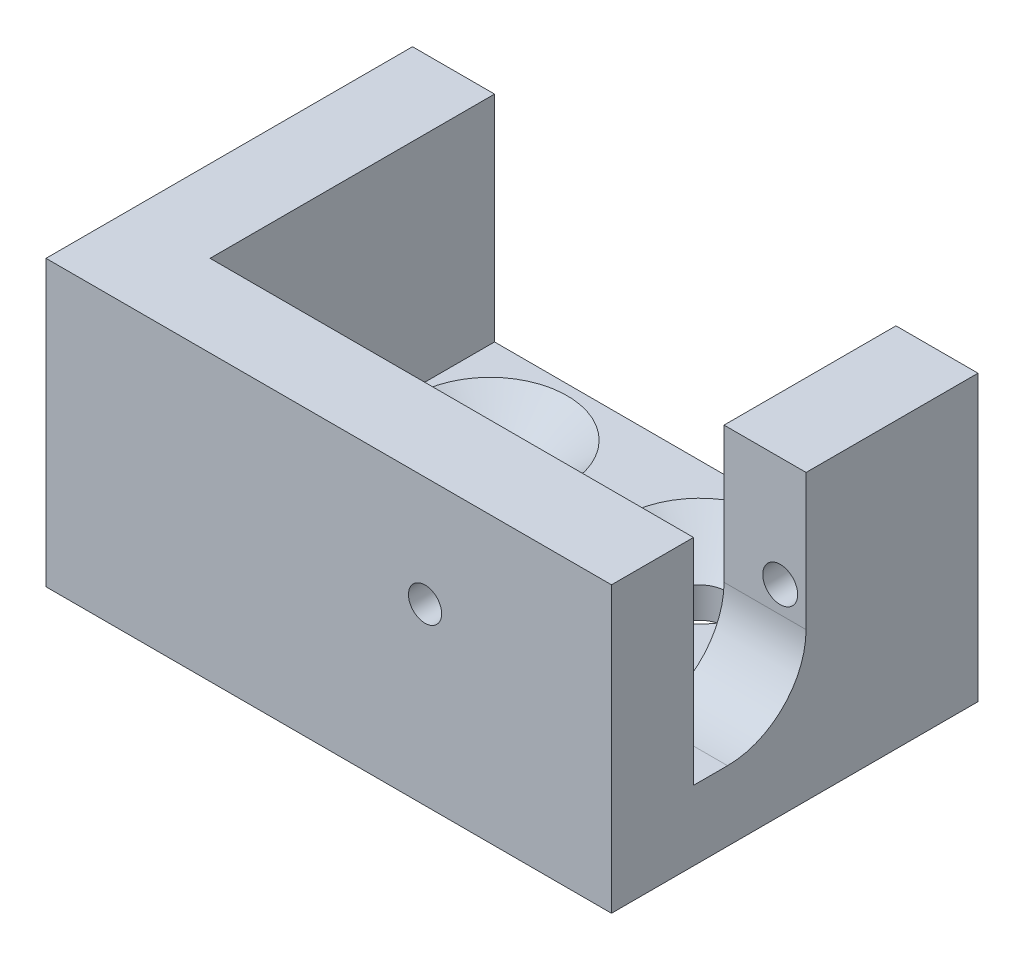
ISO-10303-21;
HEADER;
FILE_DESCRIPTION(('STEP AP214'),'2;1');
FILE_NAME('part.step','',(''),(''),'','','');
FILE_SCHEMA(('AUTOMOTIVE_DESIGN { 1 0 10303 214 1 1 1 1 }'));
ENDSEC;
DATA;
#1=APPLICATION_CONTEXT('core data for automotive mechanical design processes');
#2=APPLICATION_PROTOCOL_DEFINITION('international standard','automotive_design',2000,#1);
#3=PRODUCT_CONTEXT('',#1,'mechanical');
#4=PRODUCT('Part','Part','',(#3));
#5=PRODUCT_RELATED_PRODUCT_CATEGORY('part','',(#4));
#6=PRODUCT_DEFINITION_FORMATION('','',#4);
#7=PRODUCT_DEFINITION_CONTEXT('part definition',#1,'design');
#8=PRODUCT_DEFINITION('design','',#6,#7);
#9=PRODUCT_DEFINITION_SHAPE('','',#8);
#10=(LENGTH_UNIT() NAMED_UNIT(*) SI_UNIT(.MILLI.,.METRE.));
#11=(NAMED_UNIT(*) PLANE_ANGLE_UNIT() SI_UNIT($,.RADIAN.));
#12=(NAMED_UNIT(*) SI_UNIT($,.STERADIAN.) SOLID_ANGLE_UNIT());
#13=UNCERTAINTY_MEASURE_WITH_UNIT(LENGTH_MEASURE(1.E-05),#10,'distance_accuracy_value','');
#14=(GEOMETRIC_REPRESENTATION_CONTEXT(3) GLOBAL_UNCERTAINTY_ASSIGNED_CONTEXT((#13)) GLOBAL_UNIT_ASSIGNED_CONTEXT((#10,
#11,#12)) REPRESENTATION_CONTEXT('',''));
#15=CARTESIAN_POINT('',(0.,0.,0.));
#16=DIRECTION('',(0.,0.,1.));
#17=DIRECTION('',(1.,0.,0.));
#18=AXIS2_PLACEMENT_3D('',#15,#16,#17);
#19=CARTESIAN_POINT('',(0.,4.,0.));
#20=DIRECTION('',(0.,1.,0.));
#21=DIRECTION('',(0.,0.,1.));
#22=AXIS2_PLACEMENT_3D('',#19,#20,#21);
#23=PLANE('',#22);
#24=CARTESIAN_POINT('',(-6.,4.,5.00000000000001));
#25=DIRECTION('',(0.,1.,0.));
#26=DIRECTION('',(0.,0.,1.));
#27=AXIS2_PLACEMENT_3D('',#24,#25,#26);
#28=CIRCLE('',#27,4.41500000000001);
#29=CARTESIAN_POINT('',(-6.,4.,9.41500000000002));
#30=VERTEX_POINT('',#29);
#31=EDGE_CURVE('E51',#30,#30,#28,.F.);
#32=ORIENTED_EDGE('',*,*,#31,.T.);
#33=EDGE_LOOP('',(#32));
#34=FACE_BOUND('',#33,.T.);
#35=CARTESIAN_POINT('',(6.,4.,5.00000000000001));
#36=DIRECTION('',(0.,1.,0.));
#37=DIRECTION('',(0.,0.,1.));
#38=AXIS2_PLACEMENT_3D('',#35,#36,#37);
#39=CIRCLE('',#38,4.41500000000001);
#40=CARTESIAN_POINT('',(6.,4.,9.41500000000002));
#41=VERTEX_POINT('',#40);
#42=EDGE_CURVE('E272',#41,#41,#39,.F.);
#43=ORIENTED_EDGE('',*,*,#42,.T.);
#44=EDGE_LOOP('',(#43));
#45=FACE_BOUND('',#44,.T.);
#46=DIRECTION('',(0.,0.,-1.));
#47=VECTOR('',#46,1.);
#48=CARTESIAN_POINT('',(16.95,4.,0.));
#49=LINE('',#48,#47);
#50=CARTESIAN_POINT('',(16.95,4.,16.3));
#51=VERTEX_POINT('',#50);
#52=CARTESIAN_POINT('',(16.95,4.,14.35));
#53=VERTEX_POINT('',#52);
#54=EDGE_CURVE('E217',#51,#53,#49,.T.);
#55=ORIENTED_EDGE('',*,*,#54,.T.);
#56=DIRECTION('',(1.,0.,0.));
#57=VECTOR('',#56,1.);
#58=CARTESIAN_POINT('',(0.,4.,14.35));
#59=LINE('',#58,#57);
#60=CARTESIAN_POINT('',(12.25,4.,14.35));
#61=VERTEX_POINT('',#60);
#62=EDGE_CURVE('E260',#53,#61,#59,.F.);
#63=ORIENTED_EDGE('',*,*,#62,.T.);
#64=DIRECTION('',(0.,0.,1.));
#65=VECTOR('',#64,1.);
#66=CARTESIAN_POINT('',(12.25,4.,0.));
#67=LINE('',#66,#65);
#68=CARTESIAN_POINT('',(12.25,4.,0.));
#69=VERTEX_POINT('',#68);
#70=EDGE_CURVE('E58',#69,#61,#67,.T.);
#71=ORIENTED_EDGE('',*,*,#70,.F.);
#72=DIRECTION('',(-1.,0.,0.));
#73=VECTOR('',#72,1.);
#74=CARTESIAN_POINT('',(-15.45,4.,0.));
#75=LINE('',#74,#73);
#76=CARTESIAN_POINT('',(-10.75,4.,0.));
#77=VERTEX_POINT('',#76);
#78=EDGE_CURVE('E220',#69,#77,#75,.T.);
#79=ORIENTED_EDGE('',*,*,#78,.T.);
#80=DIRECTION('',(0.,0.,-1.));
#81=VECTOR('',#80,1.);
#82=CARTESIAN_POINT('',(-10.75,4.,0.));
#83=LINE('',#82,#81);
#84=CARTESIAN_POINT('',(-10.75,4.,16.3));
#85=VERTEX_POINT('',#84);
#86=EDGE_CURVE('E181',#85,#77,#83,.T.);
#87=ORIENTED_EDGE('',*,*,#86,.F.);
#88=DIRECTION('',(-1.,0.,0.));
#89=VECTOR('',#88,1.);
#90=CARTESIAN_POINT('',(16.95,4.,16.3));
#91=LINE('',#90,#89);
#92=EDGE_CURVE('E175',#51,#85,#91,.T.);
#93=ORIENTED_EDGE('',*,*,#92,.F.);
#94=EDGE_LOOP('',(#55,#63,#71,#79,#87,#93));
#95=FACE_BOUND('',#94,.T.);
#96=ADVANCED_FACE('F41',(#34,#45,#95),#23,.T.);
#97=CARTESIAN_POINT('',(-15.45,4.,0.));
#98=DIRECTION('',(1.,0.,0.));
#99=DIRECTION('',(0.,0.,-1.));
#100=AXIS2_PLACEMENT_3D('',#97,#98,#99);
#101=PLANE('',#100);
#102=DIRECTION('',(0.,0.,1.));
#103=VECTOR('',#102,1.);
#104=CARTESIAN_POINT('',(-15.45,0.,0.));
#105=LINE('',#104,#103);
#106=CARTESIAN_POINT('',(-15.45,0.,0.));
#107=VERTEX_POINT('',#106);
#108=CARTESIAN_POINT('',(-15.45,0.,21.));
#109=VERTEX_POINT('',#108);
#110=EDGE_CURVE('E216',#107,#109,#105,.T.);
#111=ORIENTED_EDGE('',*,*,#110,.T.);
#112=DIRECTION('',(0.,-1.,0.));
#113=VECTOR('',#112,1.);
#114=CARTESIAN_POINT('',(-15.45,4.,21.));
#115=LINE('',#114,#113);
#116=CARTESIAN_POINT('',(-15.45,16.3,21.));
#117=VERTEX_POINT('',#116);
#118=EDGE_CURVE('E239',#117,#109,#115,.T.);
#119=ORIENTED_EDGE('',*,*,#118,.F.);
#120=DIRECTION('',(0.,0.,1.));
#121=VECTOR('',#120,1.);
#122=CARTESIAN_POINT('',(-15.45,16.3,0.));
#123=LINE('',#122,#121);
#124=CARTESIAN_POINT('',(-15.45,16.3,0.));
#125=VERTEX_POINT('',#124);
#126=EDGE_CURVE('E176',#125,#117,#123,.T.);
#127=ORIENTED_EDGE('',*,*,#126,.F.);
#128=DIRECTION('',(0.,-1.,0.));
#129=VECTOR('',#128,1.);
#130=CARTESIAN_POINT('',(-15.45,4.,0.));
#131=LINE('',#130,#129);
#132=EDGE_CURVE('E138',#125,#107,#131,.T.);
#133=ORIENTED_EDGE('',*,*,#132,.T.);
#134=EDGE_LOOP('',(#111,#119,#127,#133));
#135=FACE_BOUND('',#134,.T.);
#136=ADVANCED_FACE('F336',(#135),#101,.F.);
#137=CARTESIAN_POINT('',(-15.45,4.,21.));
#138=DIRECTION('',(0.,0.,-1.));
#139=DIRECTION('',(-1.,0.,0.));
#140=AXIS2_PLACEMENT_3D('',#137,#138,#139);
#141=PLANE('',#140);
#142=CARTESIAN_POINT('',(6.26837206051751,10.,21.));
#143=DIRECTION('',(0.,0.,1.));
#144=DIRECTION('',(1.,0.,0.));
#145=AXIS2_PLACEMENT_3D('',#142,#143,#144);
#146=CIRCLE('',#145,0.949999999999997);
#147=CARTESIAN_POINT('',(7.21837206051751,10.,21.));
#148=VERTEX_POINT('',#147);
#149=EDGE_CURVE('E157',#148,#148,#146,.T.);
#150=ORIENTED_EDGE('',*,*,#149,.F.);
#151=EDGE_LOOP('',(#150));
#152=FACE_BOUND('',#151,.T.);
#153=DIRECTION('',(1.,0.,0.));
#154=VECTOR('',#153,1.);
#155=CARTESIAN_POINT('',(-15.45,0.,21.));
#156=LINE('',#155,#154);
#157=CARTESIAN_POINT('',(16.95,0.,21.));
#158=VERTEX_POINT('',#157);
#159=EDGE_CURVE('E227',#109,#158,#156,.T.);
#160=ORIENTED_EDGE('',*,*,#159,.T.);
#161=DIRECTION('',(0.,-1.,0.));
#162=VECTOR('',#161,1.);
#163=CARTESIAN_POINT('',(16.95,4.,21.));
#164=LINE('',#163,#162);
#165=CARTESIAN_POINT('',(16.95,16.3,21.));
#166=VERTEX_POINT('',#165);
#167=EDGE_CURVE('E137',#166,#158,#164,.T.);
#168=ORIENTED_EDGE('',*,*,#167,.F.);
#169=DIRECTION('',(1.,0.,0.));
#170=VECTOR('',#169,1.);
#171=CARTESIAN_POINT('',(16.95,16.3,21.));
#172=LINE('',#171,#170);
#173=EDGE_CURVE('E180',#117,#166,#172,.T.);
#174=ORIENTED_EDGE('',*,*,#173,.F.);
#175=ORIENTED_EDGE('',*,*,#118,.T.);
#176=EDGE_LOOP('',(#160,#168,#174,#175));
#177=FACE_BOUND('',#176,.T.);
#178=ADVANCED_FACE('F332',(#152,#177),#141,.F.);
#179=CARTESIAN_POINT('',(16.95,4.,0.));
#180=DIRECTION('',(-1.,0.,0.));
#181=DIRECTION('',(0.,0.,1.));
#182=AXIS2_PLACEMENT_3D('',#179,#180,#181);
#183=PLANE('',#182);
#184=DIRECTION('',(0.,0.,-1.));
#185=VECTOR('',#184,1.);
#186=CARTESIAN_POINT('',(16.95,0.,0.));
#187=LINE('',#186,#185);
#188=CARTESIAN_POINT('',(16.95,0.,0.));
#189=VERTEX_POINT('',#188);
#190=EDGE_CURVE('E133',#158,#189,#187,.T.);
#191=ORIENTED_EDGE('',*,*,#190,.T.);
#192=DIRECTION('',(0.,-1.,0.));
#193=VECTOR('',#192,1.);
#194=CARTESIAN_POINT('',(16.95,4.,0.));
#195=LINE('',#194,#193);
#196=CARTESIAN_POINT('',(16.95,16.3,0.));
#197=VERTEX_POINT('',#196);
#198=EDGE_CURVE('E126',#197,#189,#195,.T.);
#199=ORIENTED_EDGE('',*,*,#198,.F.);
#200=DIRECTION('',(0.,0.,-1.));
#201=VECTOR('',#200,1.);
#202=CARTESIAN_POINT('',(16.95,16.3,0.));
#203=LINE('',#202,#201);
#204=CARTESIAN_POINT('',(16.95,16.3,9.85000000000001));
#205=VERTEX_POINT('',#204);
#206=EDGE_CURVE('E130',#205,#197,#203,.T.);
#207=ORIENTED_EDGE('',*,*,#206,.F.);
#208=DIRECTION('',(0.,-1.,0.));
#209=VECTOR('',#208,1.);
#210=CARTESIAN_POINT('',(16.95,16.3,9.85000000000001));
#211=LINE('',#210,#209);
#212=CARTESIAN_POINT('',(16.95,8.5,9.85000000000001));
#213=VERTEX_POINT('',#212);
#214=EDGE_CURVE('E165',#205,#213,#211,.T.);
#215=ORIENTED_EDGE('',*,*,#214,.T.);
#216=CARTESIAN_POINT('',(16.95,8.5,14.35));
#217=DIRECTION('',(-1.,0.,0.));
#218=DIRECTION('',(0.,0.,1.));
#219=AXIS2_PLACEMENT_3D('',#216,#217,#218);
#220=CIRCLE('',#219,4.5);
#221=EDGE_CURVE('E66',#213,#53,#220,.T.);
#222=ORIENTED_EDGE('',*,*,#221,.T.);
#223=ORIENTED_EDGE('',*,*,#54,.F.);
#224=DIRECTION('',(0.,-1.,0.));
#225=VECTOR('',#224,1.);
#226=CARTESIAN_POINT('',(16.95,16.3,16.3));
#227=LINE('',#226,#225);
#228=CARTESIAN_POINT('',(16.95,16.3,16.3));
#229=VERTEX_POINT('',#228);
#230=EDGE_CURVE('E212',#229,#51,#227,.T.);
#231=ORIENTED_EDGE('',*,*,#230,.F.);
#232=DIRECTION('',(0.,0.,-1.));
#233=VECTOR('',#232,1.);
#234=CARTESIAN_POINT('',(16.95,16.3,16.3));
#235=LINE('',#234,#233);
#236=EDGE_CURVE('E185',#166,#229,#235,.T.);
#237=ORIENTED_EDGE('',*,*,#236,.F.);
#238=ORIENTED_EDGE('',*,*,#167,.T.);
#239=EDGE_LOOP('',(#191,#199,#207,#215,#222,#223,#231,#237,#238));
#240=FACE_BOUND('',#239,.T.);
#241=ADVANCED_FACE('F128',(#240),#183,.F.);
#242=CARTESIAN_POINT('',(-15.45,4.,0.));
#243=DIRECTION('',(0.,0.,1.));
#244=DIRECTION('',(1.,0.,0.));
#245=AXIS2_PLACEMENT_3D('',#242,#243,#244);
#246=PLANE('',#245);
#247=CARTESIAN_POINT('',(15.4682683390567,10.,0.));
#248=DIRECTION('',(0.,0.,-1.));
#249=DIRECTION('',(-1.,0.,0.));
#250=AXIS2_PLACEMENT_3D('',#247,#248,#249);
#251=CIRCLE('',#250,1.);
#252=CARTESIAN_POINT('',(14.4682683390567,10.,0.));
#253=VERTEX_POINT('',#252);
#254=EDGE_CURVE('E256',#253,#253,#251,.T.);
#255=ORIENTED_EDGE('',*,*,#254,.F.);
#256=EDGE_LOOP('',(#255));
#257=FACE_BOUND('',#256,.T.);
#258=CARTESIAN_POINT('',(-13.2783546303813,10.,0.));
#259=DIRECTION('',(0.,0.,-1.));
#260=DIRECTION('',(-1.,0.,0.));
#261=AXIS2_PLACEMENT_3D('',#258,#259,#260);
#262=CIRCLE('',#261,1.);
#263=CARTESIAN_POINT('',(-14.2783546303813,10.,0.));
#264=VERTEX_POINT('',#263);
#265=EDGE_CURVE('E296',#264,#264,#262,.T.);
#266=ORIENTED_EDGE('',*,*,#265,.F.);
#267=EDGE_LOOP('',(#266));
#268=FACE_BOUND('',#267,.T.);
#269=DIRECTION('',(-1.,0.,0.));
#270=VECTOR('',#269,1.);
#271=CARTESIAN_POINT('',(-15.45,0.,0.));
#272=LINE('',#271,#270);
#273=EDGE_CURVE('E221',#189,#107,#272,.T.);
#274=ORIENTED_EDGE('',*,*,#273,.T.);
#275=ORIENTED_EDGE('',*,*,#132,.F.);
#276=DIRECTION('',(-1.,0.,0.));
#277=VECTOR('',#276,1.);
#278=CARTESIAN_POINT('',(-15.45,16.3,0.));
#279=LINE('',#278,#277);
#280=CARTESIAN_POINT('',(-10.75,16.3,0.));
#281=VERTEX_POINT('',#280);
#282=EDGE_CURVE('E194',#281,#125,#279,.T.);
#283=ORIENTED_EDGE('',*,*,#282,.F.);
#284=DIRECTION('',(0.,-1.,0.));
#285=VECTOR('',#284,1.);
#286=CARTESIAN_POINT('',(-10.75,16.3,0.));
#287=LINE('',#286,#285);
#288=EDGE_CURVE('E198',#281,#77,#287,.T.);
#289=ORIENTED_EDGE('',*,*,#288,.T.);
#290=ORIENTED_EDGE('',*,*,#78,.F.);
#291=DIRECTION('',(0.,-1.,0.));
#292=VECTOR('',#291,1.);
#293=CARTESIAN_POINT('',(12.25,16.3,0.));
#294=LINE('',#293,#292);
#295=CARTESIAN_POINT('',(12.25,16.3,0.));
#296=VERTEX_POINT('',#295);
#297=EDGE_CURVE('E144',#296,#69,#294,.T.);
#298=ORIENTED_EDGE('',*,*,#297,.F.);
#299=DIRECTION('',(-1.,0.,0.));
#300=VECTOR('',#299,1.);
#301=CARTESIAN_POINT('',(16.95,16.3,0.));
#302=LINE('',#301,#300);
#303=EDGE_CURVE('E141',#197,#296,#302,.T.);
#304=ORIENTED_EDGE('',*,*,#303,.F.);
#305=ORIENTED_EDGE('',*,*,#198,.T.);
#306=EDGE_LOOP('',(#274,#275,#283,#289,#290,#298,#304,#305));
#307=FACE_BOUND('',#306,.T.);
#308=ADVANCED_FACE('F142',(#257,#268,#307),#246,.F.);
#309=CARTESIAN_POINT('',(0.,0.,0.));
#310=DIRECTION('',(0.,1.,0.));
#311=DIRECTION('',(0.,0.,1.));
#312=AXIS2_PLACEMENT_3D('',#309,#310,#311);
#313=PLANE('',#312);
#314=CARTESIAN_POINT('',(-6.,0.,5.00000000000001));
#315=DIRECTION('',(0.,1.,0.));
#316=DIRECTION('',(0.,0.,1.));
#317=AXIS2_PLACEMENT_3D('',#314,#315,#316);
#318=CIRCLE('',#317,1.5);
#319=CARTESIAN_POINT('',(-6.,0.,6.50000000000001));
#320=VERTEX_POINT('',#319);
#321=EDGE_CURVE('E293',#320,#320,#318,.T.);
#322=ORIENTED_EDGE('',*,*,#321,.T.);
#323=EDGE_LOOP('',(#322));
#324=FACE_BOUND('',#323,.T.);
#325=CARTESIAN_POINT('',(6.,0.,5.00000000000001));
#326=DIRECTION('',(0.,1.,0.));
#327=DIRECTION('',(0.,0.,1.));
#328=AXIS2_PLACEMENT_3D('',#325,#326,#327);
#329=CIRCLE('',#328,1.5);
#330=CARTESIAN_POINT('',(6.,0.,6.50000000000001));
#331=VERTEX_POINT('',#330);
#332=EDGE_CURVE('E297',#331,#331,#329,.T.);
#333=ORIENTED_EDGE('',*,*,#332,.T.);
#334=EDGE_LOOP('',(#333));
#335=FACE_BOUND('',#334,.T.);
#336=ORIENTED_EDGE('',*,*,#110,.F.);
#337=ORIENTED_EDGE('',*,*,#273,.F.);
#338=ORIENTED_EDGE('',*,*,#190,.F.);
#339=ORIENTED_EDGE('',*,*,#159,.F.);
#340=EDGE_LOOP('',(#336,#337,#338,#339));
#341=FACE_BOUND('',#340,.T.);
#342=ADVANCED_FACE('F323',(#324,#335,#341),#313,.F.);
#343=CARTESIAN_POINT('',(16.95,16.3,16.3));
#344=DIRECTION('',(0.,0.,1.));
#345=DIRECTION('',(1.,0.,0.));
#346=AXIS2_PLACEMENT_3D('',#343,#344,#345);
#347=PLANE('',#346);
#348=CARTESIAN_POINT('',(6.26837206051751,10.,16.3));
#349=DIRECTION('',(0.,0.,1.));
#350=DIRECTION('',(1.,0.,0.));
#351=AXIS2_PLACEMENT_3D('',#348,#349,#350);
#352=CIRCLE('',#351,2.865);
#353=CARTESIAN_POINT('',(3.40337206051751,10.,16.3));
#354=VERTEX_POINT('',#353);
#355=EDGE_CURVE('E247',#354,#354,#352,.T.);
#356=ORIENTED_EDGE('',*,*,#355,.T.);
#357=EDGE_LOOP('',(#356));
#358=FACE_BOUND('',#357,.T.);
#359=ORIENTED_EDGE('',*,*,#92,.T.);
#360=DIRECTION('',(0.,-1.,0.));
#361=VECTOR('',#360,1.);
#362=CARTESIAN_POINT('',(-10.75,16.3,16.3));
#363=LINE('',#362,#361);
#364=CARTESIAN_POINT('',(-10.75,16.3,16.3));
#365=VERTEX_POINT('',#364);
#366=EDGE_CURVE('E208',#365,#85,#363,.T.);
#367=ORIENTED_EDGE('',*,*,#366,.F.);
#368=DIRECTION('',(-1.,0.,0.));
#369=VECTOR('',#368,1.);
#370=CARTESIAN_POINT('',(16.95,16.3,16.3));
#371=LINE('',#370,#369);
#372=EDGE_CURVE('E188',#229,#365,#371,.T.);
#373=ORIENTED_EDGE('',*,*,#372,.F.);
#374=ORIENTED_EDGE('',*,*,#230,.T.);
#375=EDGE_LOOP('',(#359,#367,#373,#374));
#376=FACE_BOUND('',#375,.T.);
#377=ADVANCED_FACE('F330',(#358,#376),#347,.F.);
#378=CARTESIAN_POINT('',(-10.75,16.3,0.));
#379=DIRECTION('',(-1.,0.,0.));
#380=DIRECTION('',(0.,0.,1.));
#381=AXIS2_PLACEMENT_3D('',#378,#379,#380);
#382=PLANE('',#381);
#383=ORIENTED_EDGE('',*,*,#86,.T.);
#384=ORIENTED_EDGE('',*,*,#288,.F.);
#385=DIRECTION('',(0.,0.,-1.));
#386=VECTOR('',#385,1.);
#387=CARTESIAN_POINT('',(-10.75,16.3,0.));
#388=LINE('',#387,#386);
#389=EDGE_CURVE('E191',#365,#281,#388,.T.);
#390=ORIENTED_EDGE('',*,*,#389,.F.);
#391=ORIENTED_EDGE('',*,*,#366,.T.);
#392=EDGE_LOOP('',(#383,#384,#390,#391));
#393=FACE_BOUND('',#392,.T.);
#394=ADVANCED_FACE('F346',(#393),#382,.F.);
#395=CARTESIAN_POINT('',(0.,16.3,0.));
#396=DIRECTION('',(0.,-1.,0.));
#397=DIRECTION('',(0.,0.,-1.));
#398=AXIS2_PLACEMENT_3D('',#395,#396,#397);
#399=PLANE('',#398);
#400=ORIENTED_EDGE('',*,*,#126,.T.);
#401=ORIENTED_EDGE('',*,*,#173,.T.);
#402=ORIENTED_EDGE('',*,*,#236,.T.);
#403=ORIENTED_EDGE('',*,*,#372,.T.);
#404=ORIENTED_EDGE('',*,*,#389,.T.);
#405=ORIENTED_EDGE('',*,*,#282,.T.);
#406=EDGE_LOOP('',(#400,#401,#402,#403,#404,#405));
#407=FACE_BOUND('',#406,.T.);
#408=ADVANCED_FACE('F350',(#407),#399,.F.);
#409=CARTESIAN_POINT('',(12.25,16.3,0.));
#410=DIRECTION('',(1.,0.,0.));
#411=DIRECTION('',(0.,0.,-1.));
#412=AXIS2_PLACEMENT_3D('',#409,#410,#411);
#413=PLANE('',#412);
#414=ORIENTED_EDGE('',*,*,#70,.T.);
#415=CARTESIAN_POINT('',(12.25,8.5,14.35));
#416=DIRECTION('',(1.,0.,0.));
#417=DIRECTION('',(0.,0.,-1.));
#418=AXIS2_PLACEMENT_3D('',#415,#416,#417);
#419=CIRCLE('',#418,4.5);
#420=CARTESIAN_POINT('',(12.25,8.5,9.85000000000001));
#421=VERTEX_POINT('',#420);
#422=EDGE_CURVE('E265',#61,#421,#419,.T.);
#423=ORIENTED_EDGE('',*,*,#422,.T.);
#424=DIRECTION('',(0.,-1.,0.));
#425=VECTOR('',#424,1.);
#426=CARTESIAN_POINT('',(12.25,16.3,9.85000000000001));
#427=LINE('',#426,#425);
#428=CARTESIAN_POINT('',(12.25,16.3,9.85000000000001));
#429=VERTEX_POINT('',#428);
#430=EDGE_CURVE('E169',#429,#421,#427,.T.);
#431=ORIENTED_EDGE('',*,*,#430,.F.);
#432=DIRECTION('',(0.,0.,1.));
#433=VECTOR('',#432,1.);
#434=CARTESIAN_POINT('',(12.25,16.3,0.));
#435=LINE('',#434,#433);
#436=EDGE_CURVE('E148',#296,#429,#435,.T.);
#437=ORIENTED_EDGE('',*,*,#436,.F.);
#438=ORIENTED_EDGE('',*,*,#297,.T.);
#439=EDGE_LOOP('',(#414,#423,#431,#437,#438));
#440=FACE_BOUND('',#439,.T.);
#441=ADVANCED_FACE('F354',(#440),#413,.F.);
#442=CARTESIAN_POINT('',(16.95,16.3,9.85000000000001));
#443=DIRECTION('',(0.,0.,-1.));
#444=DIRECTION('',(-1.,0.,0.));
#445=AXIS2_PLACEMENT_3D('',#442,#443,#444);
#446=PLANE('',#445);
#447=CARTESIAN_POINT('',(15.4682683390567,10.,9.85000000000001));
#448=DIRECTION('',(0.,0.,-1.));
#449=DIRECTION('',(-1.,0.,0.));
#450=AXIS2_PLACEMENT_3D('',#447,#448,#449);
#451=CIRCLE('',#450,1.);
#452=CARTESIAN_POINT('',(14.4682683390567,10.,9.85000000000001));
#453=VERTEX_POINT('',#452);
#454=EDGE_CURVE('E252',#453,#453,#451,.T.);
#455=ORIENTED_EDGE('',*,*,#454,.T.);
#456=EDGE_LOOP('',(#455));
#457=FACE_BOUND('',#456,.T.);
#458=ORIENTED_EDGE('',*,*,#430,.T.);
#459=DIRECTION('',(1.,0.,0.));
#460=VECTOR('',#459,1.);
#461=CARTESIAN_POINT('',(16.95,8.5,9.85000000000001));
#462=LINE('',#461,#460);
#463=EDGE_CURVE('E251',#421,#213,#462,.T.);
#464=ORIENTED_EDGE('',*,*,#463,.T.);
#465=ORIENTED_EDGE('',*,*,#214,.F.);
#466=DIRECTION('',(1.,0.,0.));
#467=VECTOR('',#466,1.);
#468=CARTESIAN_POINT('',(16.95,16.3,9.85000000000001));
#469=LINE('',#468,#467);
#470=EDGE_CURVE('E152',#429,#205,#469,.T.);
#471=ORIENTED_EDGE('',*,*,#470,.F.);
#472=EDGE_LOOP('',(#458,#464,#465,#471));
#473=FACE_BOUND('',#472,.T.);
#474=ADVANCED_FACE('F358',(#457,#473),#446,.F.);
#475=CARTESIAN_POINT('',(0.,16.3,0.));
#476=DIRECTION('',(0.,-1.,0.));
#477=DIRECTION('',(0.,0.,-1.));
#478=AXIS2_PLACEMENT_3D('',#475,#476,#477);
#479=PLANE('',#478);
#480=ORIENTED_EDGE('',*,*,#206,.T.);
#481=ORIENTED_EDGE('',*,*,#303,.T.);
#482=ORIENTED_EDGE('',*,*,#436,.T.);
#483=ORIENTED_EDGE('',*,*,#470,.T.);
#484=EDGE_LOOP('',(#480,#481,#482,#483));
#485=FACE_BOUND('',#484,.T.);
#486=ADVANCED_FACE('F150',(#485),#479,.F.);
#487=CARTESIAN_POINT('',(6.26837206051751,10.,-0.000999999999990592));
#488=DIRECTION('',(0.,0.,1.));
#489=DIRECTION('',(1.,0.,0.));
#490=AXIS2_PLACEMENT_3D('',#487,#488,#489);
#491=CYLINDRICAL_SURFACE('',#490,0.949999999999997);
#492=CARTESIAN_POINT('',(6.26837206051751,10.,17.9));
#493=DIRECTION('',(0.,0.,1.));
#494=DIRECTION('',(1.,0.,0.));
#495=AXIS2_PLACEMENT_3D('',#492,#493,#494);
#496=CIRCLE('',#495,0.949999999999997);
#497=CARTESIAN_POINT('',(5.31837206051751,10.,17.9));
#498=VERTEX_POINT('',#497);
#499=EDGE_CURVE('E243',#498,#498,#496,.F.);
#500=ORIENTED_EDGE('',*,*,#499,.T.);
#501=EDGE_LOOP('',(#500));
#502=FACE_BOUND('',#501,.T.);
#503=ORIENTED_EDGE('',*,*,#149,.T.);
#504=EDGE_LOOP('',(#503));
#505=FACE_BOUND('',#504,.T.);
#506=ADVANCED_FACE('F364',(#502,#505),#491,.F.);
#507=CARTESIAN_POINT('',(6.26837206051751,10.,17.9));
#508=DIRECTION('',(0.,0.,-1.));
#509=DIRECTION('',(-1.,0.,0.));
#510=AXIS2_PLACEMENT_3D('',#507,#508,#509);
#511=CONICAL_SURFACE('',#510,0.949999999999997,0.87477534222011);
#512=CARTESIAN_POINT('',(3.40337206051751,10.,16.3));
#513=CARTESIAN_POINT('',(3.42331997718418,10.,16.3166666666667));
#514=CARTESIAN_POINT('',(3.44326789385084,10.,16.3333333333333));
#515=CARTESIAN_POINT('',(3.48316372718418,10.,16.3666666666667));
#516=CARTESIAN_POINT('',(3.50311164385084,10.,16.3833333333333));
#517=CARTESIAN_POINT('',(3.54300747718418,10.,16.4166666666667));
#518=CARTESIAN_POINT('',(3.56295539385084,10.,16.4333333333333));
#519=CARTESIAN_POINT('',(3.60285122718418,10.,16.4666666666667));
#520=CARTESIAN_POINT('',(3.62279914385084,10.,16.4833333333333));
#521=CARTESIAN_POINT('',(3.66269497718418,10.,16.5166666666667));
#522=CARTESIAN_POINT('',(3.68264289385084,10.,16.5333333333333));
#523=CARTESIAN_POINT('',(3.72253872718418,10.,16.5666666666667));
#524=CARTESIAN_POINT('',(3.74248664385084,10.,16.5833333333333));
#525=CARTESIAN_POINT('',(3.78238247718418,10.,16.6166666666667));
#526=CARTESIAN_POINT('',(3.80233039385084,10.,16.6333333333333));
#527=CARTESIAN_POINT('',(3.84222622718418,10.,16.6666666666667));
#528=CARTESIAN_POINT('',(3.86217414385084,10.,16.6833333333333));
#529=CARTESIAN_POINT('',(3.90206997718418,10.,16.7166666666667));
#530=CARTESIAN_POINT('',(3.92201789385084,10.,16.7333333333333));
#531=CARTESIAN_POINT('',(3.96191372718418,10.,16.7666666666667));
#532=CARTESIAN_POINT('',(3.98186164385084,10.,16.7833333333333));
#533=CARTESIAN_POINT('',(4.02175747718418,10.,16.8166666666667));
#534=CARTESIAN_POINT('',(4.04170539385084,10.,16.8333333333333));
#535=CARTESIAN_POINT('',(4.08160122718418,10.,16.8666666666667));
#536=CARTESIAN_POINT('',(4.10154914385084,10.,16.8833333333333));
#537=CARTESIAN_POINT('',(4.14144497718418,10.,16.9166666666667));
#538=CARTESIAN_POINT('',(4.16139289385084,10.,16.9333333333333));
#539=CARTESIAN_POINT('',(4.20128872718418,10.,16.9666666666667));
#540=CARTESIAN_POINT('',(4.22123664385084,10.,16.9833333333333));
#541=CARTESIAN_POINT('',(4.26113247718418,10.,17.0166666666667));
#542=CARTESIAN_POINT('',(4.28108039385084,10.,17.0333333333333));
#543=CARTESIAN_POINT('',(4.32097622718418,10.,17.0666666666667));
#544=CARTESIAN_POINT('',(4.34092414385084,10.,17.0833333333333));
#545=CARTESIAN_POINT('',(4.38081997718418,10.,17.1166666666667));
#546=CARTESIAN_POINT('',(4.40076789385084,10.,17.1333333333333));
#547=CARTESIAN_POINT('',(4.44066372718418,10.,17.1666666666667));
#548=CARTESIAN_POINT('',(4.46061164385084,10.,17.1833333333333));
#549=CARTESIAN_POINT('',(4.50050747718418,10.,17.2166666666667));
#550=CARTESIAN_POINT('',(4.52045539385084,10.,17.2333333333333));
#551=CARTESIAN_POINT('',(4.56035122718418,10.,17.2666666666667));
#552=CARTESIAN_POINT('',(4.58029914385084,10.,17.2833333333333));
#553=CARTESIAN_POINT('',(4.62019497718418,10.,17.3166666666667));
#554=CARTESIAN_POINT('',(4.64014289385084,10.,17.3333333333333));
#555=CARTESIAN_POINT('',(4.68003872718417,10.,17.3666666666667));
#556=CARTESIAN_POINT('',(4.69998664385084,10.,17.3833333333333));
#557=CARTESIAN_POINT('',(4.73988247718417,10.,17.4166666666667));
#558=CARTESIAN_POINT('',(4.75983039385084,10.,17.4333333333333));
#559=CARTESIAN_POINT('',(4.79972622718418,10.,17.4666666666667));
#560=CARTESIAN_POINT('',(4.81967414385084,10.,17.4833333333333));
#561=CARTESIAN_POINT('',(4.85956997718417,10.,17.5166666666667));
#562=CARTESIAN_POINT('',(4.87951789385084,10.,17.5333333333333));
#563=CARTESIAN_POINT('',(4.91941372718417,10.,17.5666666666667));
#564=CARTESIAN_POINT('',(4.93936164385084,10.,17.5833333333333));
#565=CARTESIAN_POINT('',(4.97925747718417,10.,17.6166666666667));
#566=CARTESIAN_POINT('',(4.99920539385084,10.,17.6333333333333));
#567=CARTESIAN_POINT('',(5.03910122718418,10.,17.6666666666667));
#568=CARTESIAN_POINT('',(5.05904914385084,10.,17.6833333333333));
#569=CARTESIAN_POINT('',(5.09894497718417,10.,17.7166666666667));
#570=CARTESIAN_POINT('',(5.11889289385084,10.,17.7333333333333));
#571=CARTESIAN_POINT('',(5.15878872718417,10.,17.7666666666667));
#572=CARTESIAN_POINT('',(5.17873664385084,10.,17.7833333333333));
#573=CARTESIAN_POINT('',(5.21863247718418,10.,17.8166666666667));
#574=CARTESIAN_POINT('',(5.23858039385084,10.,17.8333333333333));
#575=CARTESIAN_POINT('',(5.27847622718417,10.,17.8666666666667));
#576=CARTESIAN_POINT('',(5.29842414385084,10.,17.8833333333333));
#577=CARTESIAN_POINT('',(5.31837206051751,10.,17.9));
#578=B_SPLINE_CURVE_WITH_KNOTS('',3,(#512,#513,#514,#515,#516,#517,#518,#519,#520,#521,#522,
#523,#524,#525,#526,#527,#528,#529,#530,#531,#532,#533,#534,#535,#536,#537,#538,#539,#540,#541,
#542,#543,#544,#545,#546,#547,#548,#549,#550,#551,#552,#553,#554,#555,#556,#557,#558,#559,#560,
#561,#562,#563,#564,#565,#566,#567,#568,#569,#570,#571,#572,#573,#574,#575,#576,#577),
.UNSPECIFIED.,.F.,.F.,(4,2,2,2,2,2,2,2,2,2,2,2,2,2,2,2,2,2,2,2,2,2,2,2,2,2,2,2,2,2,2,2,4),(0.,
0.0779825263380348,0.155965052676072,0.233947579014106,0.311930105352143,0.38991263169018,
0.467895158028215,0.545877684366252,0.623860210704287,0.701842737042324,0.779825263380359,
0.857807789718396,0.935790316056433,1.01377284239447,1.0917553687325,1.16973789507054,
1.24772042140858,1.32570294774661,1.40368547408465,1.48166800042269,1.55965052676072,
1.63763305309876,1.71561557943679,1.79359810577483,1.87158063211287,1.9495631584509,
2.02754568478894,2.10552821112697,2.18351073746501,2.26149326380305,2.33947579014108,
2.41745831647912,2.49544084281715),.UNSPECIFIED.);
#579=EDGE_CURVE('BSEAM366',#354,#498,#578,.T.);
#580=ORIENTED_EDGE('',*,*,#355,.F.);
#581=ORIENTED_EDGE('',*,*,#499,.F.);
#582=ORIENTED_EDGE('',*,*,#579,.T.);
#583=ORIENTED_EDGE('',*,*,#579,.F.);
#584=EDGE_LOOP('',(#580,#582,#581,#583));
#585=FACE_BOUND('',#584,.T.);
#586=ADVANCED_FACE('F366',(#585),#511,.F.);
#587=CARTESIAN_POINT('',(15.4682683390567,10.,10.));
#588=DIRECTION('',(0.,0.,-1.));
#589=DIRECTION('',(-1.,0.,0.));
#590=AXIS2_PLACEMENT_3D('',#587,#588,#589);
#591=CYLINDRICAL_SURFACE('',#590,1.);
#592=ORIENTED_EDGE('',*,*,#254,.T.);
#593=EDGE_LOOP('',(#592));
#594=FACE_BOUND('',#593,.T.);
#595=ORIENTED_EDGE('',*,*,#454,.F.);
#596=EDGE_LOOP('',(#595));
#597=FACE_BOUND('',#596,.T.);
#598=ADVANCED_FACE('F318',(#594,#597),#591,.F.);
#599=CARTESIAN_POINT('',(-13.2783546303813,10.,10.));
#600=DIRECTION('',(0.,0.,-1.));
#601=DIRECTION('',(-1.,0.,0.));
#602=AXIS2_PLACEMENT_3D('',#599,#600,#601);
#603=CYLINDRICAL_SURFACE('',#602,1.);
#604=CARTESIAN_POINT('',(-13.2783546303813,10.,10.));
#605=DIRECTION('',(0.,0.,-1.));
#606=DIRECTION('',(-1.,0.,0.));
#607=AXIS2_PLACEMENT_3D('',#604,#605,#606);
#608=CIRCLE('',#607,1.);
#609=CARTESIAN_POINT('',(-14.2783546303813,10.,10.));
#610=VERTEX_POINT('',#609);
#611=EDGE_CURVE('E302',#610,#610,#608,.T.);
#612=ORIENTED_EDGE('',*,*,#611,.F.);
#613=EDGE_LOOP('',(#612));
#614=FACE_BOUND('',#613,.T.);
#615=ORIENTED_EDGE('',*,*,#265,.T.);
#616=EDGE_LOOP('',(#615));
#617=FACE_BOUND('',#616,.T.);
#618=ADVANCED_FACE('F315',(#614,#617),#603,.F.);
#619=CARTESIAN_POINT('',(-13.2783546303813,10.,10.));
#620=DIRECTION('',(0.,0.,-1.));
#621=DIRECTION('',(-1.,0.,0.));
#622=AXIS2_PLACEMENT_3D('',#619,#620,#621);
#623=PLANE('',#622);
#624=ORIENTED_EDGE('',*,*,#611,.T.);
#625=EDGE_LOOP('',(#624));
#626=FACE_BOUND('',#625,.T.);
#627=ADVANCED_FACE('F313',(#626),#623,.T.);
#628=CARTESIAN_POINT('',(16.95,8.5,14.35));
#629=DIRECTION('',(1.,0.,0.));
#630=DIRECTION('',(0.,0.,-1.));
#631=AXIS2_PLACEMENT_3D('',#628,#629,#630);
#632=CYLINDRICAL_SURFACE('',#631,4.5);
#633=ORIENTED_EDGE('',*,*,#422,.F.);
#634=ORIENTED_EDGE('',*,*,#62,.F.);
#635=ORIENTED_EDGE('',*,*,#221,.F.);
#636=ORIENTED_EDGE('',*,*,#463,.F.);
#637=EDGE_LOOP('',(#633,#634,#635,#636));
#638=FACE_BOUND('',#637,.T.);
#639=ADVANCED_FACE('F371',(#638),#632,.F.);
#640=CARTESIAN_POINT('',(6.,0.,5.00000000000001));
#641=DIRECTION('',(0.,1.,0.));
#642=DIRECTION('',(0.,0.,1.));
#643=AXIS2_PLACEMENT_3D('',#640,#641,#642);
#644=CYLINDRICAL_SURFACE('',#643,1.5);
#645=CARTESIAN_POINT('',(6.,1.76,5.00000000000001));
#646=DIRECTION('',(0.,1.,0.));
#647=DIRECTION('',(0.,0.,1.));
#648=AXIS2_PLACEMENT_3D('',#645,#646,#647);
#649=CIRCLE('',#648,1.5);
#650=CARTESIAN_POINT('',(6.,1.76,6.50000000000001));
#651=VERTEX_POINT('',#650);
#652=EDGE_CURVE('E11',#651,#651,#649,.T.);
#653=ORIENTED_EDGE('',*,*,#652,.T.);
#654=EDGE_LOOP('',(#653));
#655=FACE_BOUND('',#654,.T.);
#656=ORIENTED_EDGE('',*,*,#332,.F.);
#657=EDGE_LOOP('',(#656));
#658=FACE_BOUND('',#657,.T.);
#659=ADVANCED_FACE('F289',(#655,#658),#644,.F.);
#660=CARTESIAN_POINT('',(-6.,0.,5.00000000000001));
#661=DIRECTION('',(0.,1.,0.));
#662=DIRECTION('',(0.,0.,1.));
#663=AXIS2_PLACEMENT_3D('',#660,#661,#662);
#664=CYLINDRICAL_SURFACE('',#663,1.5);
#665=CARTESIAN_POINT('',(-6.,1.76,5.00000000000001));
#666=DIRECTION('',(0.,1.,0.));
#667=DIRECTION('',(0.,0.,1.));
#668=AXIS2_PLACEMENT_3D('',#665,#666,#667);
#669=CIRCLE('',#668,1.5);
#670=CARTESIAN_POINT('',(-6.,1.76,6.50000000000001));
#671=VERTEX_POINT('',#670);
#672=EDGE_CURVE('E268',#671,#671,#669,.T.);
#673=ORIENTED_EDGE('',*,*,#672,.T.);
#674=EDGE_LOOP('',(#673));
#675=FACE_BOUND('',#674,.T.);
#676=ORIENTED_EDGE('',*,*,#321,.F.);
#677=EDGE_LOOP('',(#676));
#678=FACE_BOUND('',#677,.T.);
#679=ADVANCED_FACE('F284',(#675,#678),#664,.F.);
#680=CARTESIAN_POINT('',(-6.,1.76,5.00000000000001));
#681=DIRECTION('',(0.,1.,0.));
#682=DIRECTION('',(0.,0.,1.));
#683=AXIS2_PLACEMENT_3D('',#680,#681,#682);
#684=CONICAL_SURFACE('',#683,1.5,0.915598254206639);
#685=ORIENTED_EDGE('',*,*,#31,.F.);
#686=EDGE_LOOP('',(#685));
#687=FACE_BOUND('',#686,.T.);
#688=ORIENTED_EDGE('',*,*,#672,.F.);
#689=EDGE_LOOP('',(#688));
#690=FACE_BOUND('',#689,.T.);
#691=ADVANCED_FACE('F281',(#687,#690),#684,.F.);
#692=CARTESIAN_POINT('',(6.,1.76,5.00000000000001));
#693=DIRECTION('',(0.,1.,0.));
#694=DIRECTION('',(0.,0.,1.));
#695=AXIS2_PLACEMENT_3D('',#692,#693,#694);
#696=CONICAL_SURFACE('',#695,1.5,0.915598254206639);
#697=ORIENTED_EDGE('',*,*,#42,.F.);
#698=EDGE_LOOP('',(#697));
#699=FACE_BOUND('',#698,.T.);
#700=ORIENTED_EDGE('',*,*,#652,.F.);
#701=EDGE_LOOP('',(#700));
#702=FACE_BOUND('',#701,.T.);
#703=ADVANCED_FACE('F44',(#699,#702),#696,.F.);
#704=CLOSED_SHELL('',(#96,#136,#178,#241,#308,#342,#377,#394,#408,#441,#474,#486,#506,#586,#598,
#618,#627,#639,#659,#679,#691,#703));
#705=MANIFOLD_SOLID_BREP('B2',#704);
#706=ADVANCED_BREP_SHAPE_REPRESENTATION('',(#18,#705),#14);
#707=SHAPE_DEFINITION_REPRESENTATION(#9,#706);
ENDSEC;
END-ISO-10303-21;
